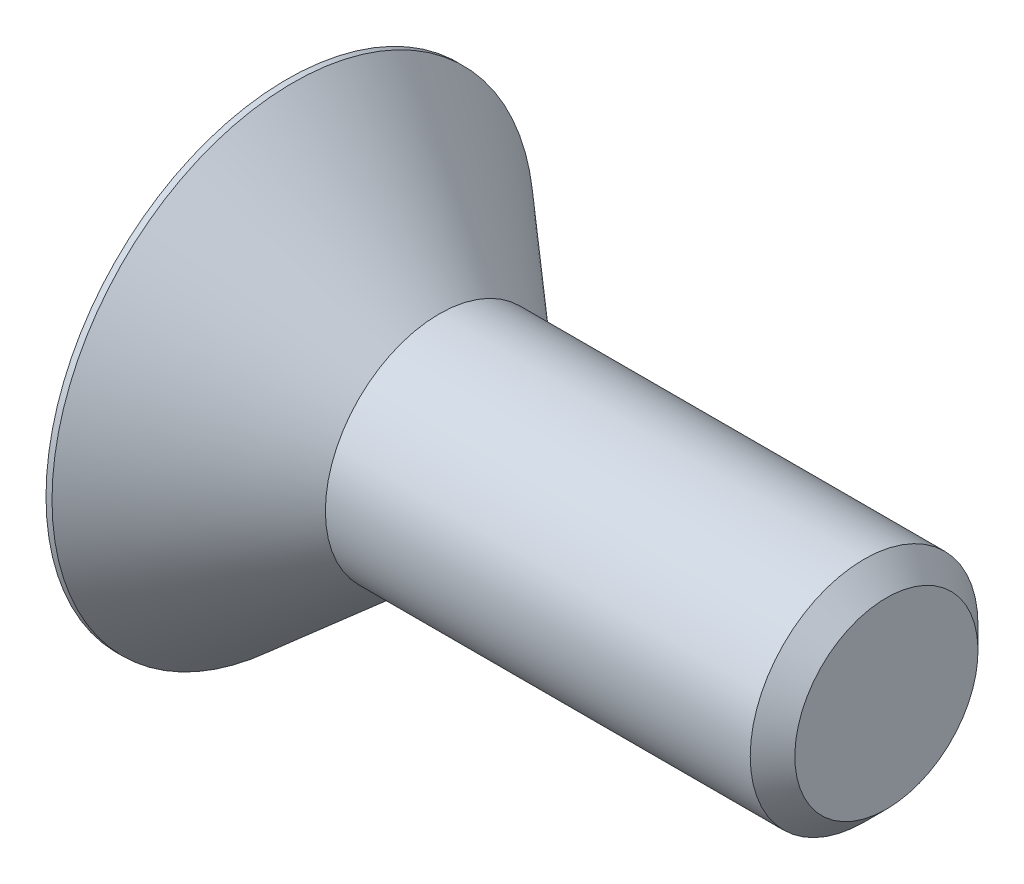
ISO-10303-21;
HEADER;
FILE_DESCRIPTION(('STEP AP214'),'2;1');
FILE_NAME('part.step','',(''),(''),'','','');
FILE_SCHEMA(('AUTOMOTIVE_DESIGN { 1 0 10303 214 1 1 1 1 }'));
ENDSEC;
DATA;
#1=APPLICATION_CONTEXT('core data for automotive mechanical design processes');
#2=APPLICATION_PROTOCOL_DEFINITION('international standard','automotive_design',2000,#1);
#3=PRODUCT_CONTEXT('',#1,'mechanical');
#4=PRODUCT('Part','Part','',(#3));
#5=PRODUCT_RELATED_PRODUCT_CATEGORY('part','',(#4));
#6=PRODUCT_DEFINITION_FORMATION('','',#4);
#7=PRODUCT_DEFINITION_CONTEXT('part definition',#1,'design');
#8=PRODUCT_DEFINITION('design','',#6,#7);
#9=PRODUCT_DEFINITION_SHAPE('','',#8);
#10=(LENGTH_UNIT() NAMED_UNIT(*) SI_UNIT(.MILLI.,.METRE.));
#11=(NAMED_UNIT(*) PLANE_ANGLE_UNIT() SI_UNIT($,.RADIAN.));
#12=(NAMED_UNIT(*) SI_UNIT($,.STERADIAN.) SOLID_ANGLE_UNIT());
#13=UNCERTAINTY_MEASURE_WITH_UNIT(LENGTH_MEASURE(1.E-05),#10,'distance_accuracy_value','');
#14=(GEOMETRIC_REPRESENTATION_CONTEXT(3) GLOBAL_UNCERTAINTY_ASSIGNED_CONTEXT((#13)) GLOBAL_UNIT_ASSIGNED_CONTEXT((#10,
#11,#12)) REPRESENTATION_CONTEXT('',''));
#15=CARTESIAN_POINT('',(0.,0.,0.));
#16=DIRECTION('',(0.,0.,1.));
#17=DIRECTION('',(1.,0.,0.));
#18=AXIS2_PLACEMENT_3D('',#15,#16,#17);
#19=CARTESIAN_POINT('',(2.20980000000282,0.,0.));
#20=DIRECTION('',(-1.,0.,0.));
#21=DIRECTION('',(0.,0.,1.));
#22=AXIS2_PLACEMENT_3D('',#19,#20,#21);
#23=CONICAL_SURFACE('',#22,1.58750000002783,1.04719755117658);
#24=CARTESIAN_POINT('',(3.12634355236696,0.,-5.6843418860808E-11));
#25=VERTEX_POINT('',#24);
#26=VERTEX_LOOP('',#25);
#27=FACE_BOUND('',#26,.T.);
#28=CARTESIAN_POINT('',(2.20980000000282,0.,0.));
#29=DIRECTION('',(-1.,0.,0.));
#30=DIRECTION('',(0.,0.,1.));
#31=AXIS2_PLACEMENT_3D('',#28,#29,#30);
#32=CIRCLE('',#31,1.58750000002783);
#33=CARTESIAN_POINT('',(2.20980000000141,1.37481532851985,-0.793750000006957));
#34=VERTEX_POINT('',#33);
#35=CARTESIAN_POINT('',(2.20980000000141,1.37481532851985,0.793750000006956));
#36=VERTEX_POINT('',#35);
#37=EDGE_CURVE('E272',#34,#36,#32,.F.);
#38=ORIENTED_EDGE('',*,*,#37,.F.);
#39=CARTESIAN_POINT('',(2.20980000000282,0.,0.));
#40=DIRECTION('',(-1.,0.,0.));
#41=DIRECTION('',(0.,0.,1.));
#42=AXIS2_PLACEMENT_3D('',#39,#40,#41);
#43=CIRCLE('',#42,1.58750000002783);
#44=CARTESIAN_POINT('',(2.20980000000141,0.,-1.58750000001392));
#45=VERTEX_POINT('',#44);
#46=EDGE_CURVE('E276',#45,#34,#43,.F.);
#47=ORIENTED_EDGE('',*,*,#46,.F.);
#48=CARTESIAN_POINT('',(2.20980000000282,0.,0.));
#49=DIRECTION('',(-1.,0.,0.));
#50=DIRECTION('',(0.,0.,1.));
#51=AXIS2_PLACEMENT_3D('',#48,#49,#50);
#52=CIRCLE('',#51,1.58750000002783);
#53=CARTESIAN_POINT('',(2.20980000000141,-1.37481532851985,-0.79375000000696));
#54=VERTEX_POINT('',#53);
#55=EDGE_CURVE('E110',#54,#45,#52,.F.);
#56=ORIENTED_EDGE('',*,*,#55,.F.);
#57=CARTESIAN_POINT('',(2.20980000000282,0.,0.));
#58=DIRECTION('',(-1.,0.,0.));
#59=DIRECTION('',(0.,0.,1.));
#60=AXIS2_PLACEMENT_3D('',#57,#58,#59);
#61=CIRCLE('',#60,1.58750000002783);
#62=CARTESIAN_POINT('',(2.20980000000141,-1.37481532851985,0.79375000000696));
#63=VERTEX_POINT('',#62);
#64=EDGE_CURVE('E20',#63,#54,#61,.F.);
#65=ORIENTED_EDGE('',*,*,#64,.F.);
#66=CARTESIAN_POINT('',(2.20980000000282,0.,0.));
#67=DIRECTION('',(-1.,0.,0.));
#68=DIRECTION('',(0.,0.,1.));
#69=AXIS2_PLACEMENT_3D('',#66,#67,#68);
#70=CIRCLE('',#69,1.58750000002783);
#71=CARTESIAN_POINT('',(2.20980000000141,0.,1.58750000001392));
#72=VERTEX_POINT('',#71);
#73=EDGE_CURVE('E107',#72,#63,#70,.F.);
#74=ORIENTED_EDGE('',*,*,#73,.F.);
#75=CARTESIAN_POINT('',(2.20980000000282,0.,0.));
#76=DIRECTION('',(-1.,0.,0.));
#77=DIRECTION('',(0.,0.,1.));
#78=AXIS2_PLACEMENT_3D('',#75,#76,#77);
#79=CIRCLE('',#78,1.58750000002783);
#80=EDGE_CURVE('E126',#36,#72,#79,.F.);
#81=ORIENTED_EDGE('',*,*,#80,.F.);
#82=EDGE_LOOP('',(#38,#47,#56,#65,#74,#81));
#83=FACE_BOUND('',#82,.T.);
#84=ADVANCED_FACE('F17',(#27,#83),#23,.F.);
#85=CARTESIAN_POINT('',(2.2098,-1.83308710467706,0.));
#86=DIRECTION('',(-1.,0.,0.));
#87=DIRECTION('',(0.,0.,1.));
#88=AXIS2_PLACEMENT_3D('',#85,#86,#87);
#89=PLANE('',#88);
#90=DIRECTION('',(0.,-0.500000000000001,0.866025403784438));
#91=VECTOR('',#90,1.);
#92=CARTESIAN_POINT('',(2.2098,-1.83308710467706,0.));
#93=LINE('',#92,#91);
#94=CARTESIAN_POINT('',(2.2098,-1.83308710467706,0.));
#95=VERTEX_POINT('',#94);
#96=EDGE_CURVE('E131',#95,#54,#93,.F.);
#97=ORIENTED_EDGE('',*,*,#96,.F.);
#98=DIRECTION('',(0.,0.500000000000002,0.866025403784438));
#99=VECTOR('',#98,1.);
#100=CARTESIAN_POINT('',(2.2098,-0.916543552338528,1.5875));
#101=LINE('',#100,#99);
#102=EDGE_CURVE('E128',#63,#95,#101,.F.);
#103=ORIENTED_EDGE('',*,*,#102,.F.);
#104=ORIENTED_EDGE('',*,*,#64,.T.);
#105=EDGE_LOOP('',(#97,#103,#104));
#106=FACE_BOUND('',#105,.T.);
#107=ADVANCED_FACE('F129',(#106),#89,.T.);
#108=CARTESIAN_POINT('',(2.2098,-1.83308710467706,0.));
#109=DIRECTION('',(-1.,0.,0.));
#110=DIRECTION('',(0.,0.,1.));
#111=AXIS2_PLACEMENT_3D('',#108,#109,#110);
#112=PLANE('',#111);
#113=DIRECTION('',(0.,1.,0.));
#114=VECTOR('',#113,1.);
#115=CARTESIAN_POINT('',(2.2098,-0.91654355233853,-1.5875));
#116=LINE('',#115,#114);
#117=CARTESIAN_POINT('',(2.2098,-0.91654355233853,-1.5875));
#118=VERTEX_POINT('',#117);
#119=EDGE_CURVE('E213',#118,#45,#116,.T.);
#120=ORIENTED_EDGE('',*,*,#119,.F.);
#121=DIRECTION('',(0.,-0.500000000000001,0.866025403784438));
#122=VECTOR('',#121,1.);
#123=CARTESIAN_POINT('',(2.2098,-1.83308710467706,0.));
#124=LINE('',#123,#122);
#125=EDGE_CURVE('E231',#54,#118,#124,.F.);
#126=ORIENTED_EDGE('',*,*,#125,.F.);
#127=ORIENTED_EDGE('',*,*,#55,.T.);
#128=EDGE_LOOP('',(#120,#126,#127));
#129=FACE_BOUND('',#128,.T.);
#130=ADVANCED_FACE('F283',(#129),#112,.T.);
#131=CARTESIAN_POINT('',(2.2098,-1.83308710467706,0.));
#132=DIRECTION('',(-1.,0.,0.));
#133=DIRECTION('',(0.,0.,1.));
#134=AXIS2_PLACEMENT_3D('',#131,#132,#133);
#135=PLANE('',#134);
#136=DIRECTION('',(0.,-0.5,-0.866025403784439));
#137=VECTOR('',#136,1.);
#138=CARTESIAN_POINT('',(2.2098,0.91654355233853,-1.5875));
#139=LINE('',#138,#137);
#140=CARTESIAN_POINT('',(2.2098,0.91654355233853,-1.5875));
#141=VERTEX_POINT('',#140);
#142=EDGE_CURVE('E190',#141,#34,#139,.F.);
#143=ORIENTED_EDGE('',*,*,#142,.F.);
#144=DIRECTION('',(0.,1.,0.));
#145=VECTOR('',#144,1.);
#146=CARTESIAN_POINT('',(2.2098,-0.91654355233853,-1.5875));
#147=LINE('',#146,#145);
#148=EDGE_CURVE('E208',#45,#141,#147,.T.);
#149=ORIENTED_EDGE('',*,*,#148,.F.);
#150=ORIENTED_EDGE('',*,*,#46,.T.);
#151=EDGE_LOOP('',(#143,#149,#150));
#152=FACE_BOUND('',#151,.T.);
#153=ADVANCED_FACE('F286',(#152),#135,.T.);
#154=CARTESIAN_POINT('',(2.2098,-1.83308710467706,0.));
#155=DIRECTION('',(-1.,0.,0.));
#156=DIRECTION('',(0.,0.,1.));
#157=AXIS2_PLACEMENT_3D('',#154,#155,#156);
#158=PLANE('',#157);
#159=DIRECTION('',(0.,0.499999999999999,-0.866025403784439));
#160=VECTOR('',#159,1.);
#161=CARTESIAN_POINT('',(2.2098,1.83308710467706,0.));
#162=LINE('',#161,#160);
#163=CARTESIAN_POINT('',(2.2098,1.83308710467706,0.));
#164=VERTEX_POINT('',#163);
#165=EDGE_CURVE('E159',#164,#36,#162,.F.);
#166=ORIENTED_EDGE('',*,*,#165,.F.);
#167=DIRECTION('',(0.,-0.5,-0.866025403784439));
#168=VECTOR('',#167,1.);
#169=CARTESIAN_POINT('',(2.2098,0.91654355233853,-1.5875));
#170=LINE('',#169,#168);
#171=EDGE_CURVE('E185',#34,#164,#170,.F.);
#172=ORIENTED_EDGE('',*,*,#171,.F.);
#173=ORIENTED_EDGE('',*,*,#37,.T.);
#174=EDGE_LOOP('',(#166,#172,#173));
#175=FACE_BOUND('',#174,.T.);
#176=ADVANCED_FACE('F310',(#175),#158,.T.);
#177=CARTESIAN_POINT('',(2.2098,-1.83308710467706,0.));
#178=DIRECTION('',(-1.,0.,0.));
#179=DIRECTION('',(0.,0.,1.));
#180=AXIS2_PLACEMENT_3D('',#177,#178,#179);
#181=PLANE('',#180);
#182=DIRECTION('',(0.,1.,0.));
#183=VECTOR('',#182,1.);
#184=CARTESIAN_POINT('',(2.2098,0.91654355233853,1.5875));
#185=LINE('',#184,#183);
#186=CARTESIAN_POINT('',(2.2098,0.91654355233853,1.5875));
#187=VERTEX_POINT('',#186);
#188=EDGE_CURVE('E153',#187,#72,#185,.F.);
#189=ORIENTED_EDGE('',*,*,#188,.F.);
#190=DIRECTION('',(0.,0.499999999999999,-0.866025403784439));
#191=VECTOR('',#190,1.);
#192=CARTESIAN_POINT('',(2.2098,1.83308710467706,0.));
#193=LINE('',#192,#191);
#194=EDGE_CURVE('E154',#36,#187,#193,.F.);
#195=ORIENTED_EDGE('',*,*,#194,.F.);
#196=ORIENTED_EDGE('',*,*,#80,.T.);
#197=EDGE_LOOP('',(#189,#195,#196));
#198=FACE_BOUND('',#197,.T.);
#199=ADVANCED_FACE('F314',(#198),#181,.T.);
#200=CARTESIAN_POINT('',(2.2098,-1.83308710467706,0.));
#201=DIRECTION('',(-1.,0.,0.));
#202=DIRECTION('',(0.,0.,1.));
#203=AXIS2_PLACEMENT_3D('',#200,#201,#202);
#204=PLANE('',#203);
#205=DIRECTION('',(0.,0.500000000000002,0.866025403784438));
#206=VECTOR('',#205,1.);
#207=CARTESIAN_POINT('',(2.2098,-0.916543552338528,1.5875));
#208=LINE('',#207,#206);
#209=CARTESIAN_POINT('',(2.2098,-0.916543552338528,1.5875));
#210=VERTEX_POINT('',#209);
#211=EDGE_CURVE('E120',#210,#63,#208,.F.);
#212=ORIENTED_EDGE('',*,*,#211,.F.);
#213=DIRECTION('',(0.,1.,0.));
#214=VECTOR('',#213,1.);
#215=CARTESIAN_POINT('',(2.2098,0.91654355233853,1.5875));
#216=LINE('',#215,#214);
#217=EDGE_CURVE('E123',#72,#210,#216,.F.);
#218=ORIENTED_EDGE('',*,*,#217,.F.);
#219=ORIENTED_EDGE('',*,*,#73,.T.);
#220=EDGE_LOOP('',(#212,#218,#219));
#221=FACE_BOUND('',#220,.T.);
#222=ADVANCED_FACE('F118',(#221),#204,.T.);
#223=CARTESIAN_POINT('',(2.2098,-0.916543552338528,1.5875));
#224=DIRECTION('',(0.,0.866025403784438,-0.500000000000002));
#225=DIRECTION('',(0.,0.500000000000002,0.866025403784438));
#226=AXIS2_PLACEMENT_3D('',#223,#224,#225);
#227=PLANE('',#226);
#228=ORIENTED_EDGE('',*,*,#102,.T.);
#229=DIRECTION('',(1.,0.,0.));
#230=VECTOR('',#229,1.);
#231=CARTESIAN_POINT('',(2.2098,-1.83308710467706,0.));
#232=LINE('',#231,#230);
#233=CARTESIAN_POINT('',(0.,-1.83308710467706,0.));
#234=VERTEX_POINT('',#233);
#235=EDGE_CURVE('E135',#234,#95,#232,.T.);
#236=ORIENTED_EDGE('',*,*,#235,.F.);
#237=DIRECTION('',(0.,-0.500000000000002,-0.866025403784438));
#238=VECTOR('',#237,1.);
#239=CARTESIAN_POINT('',(0.,-0.916543552338528,1.5875));
#240=LINE('',#239,#238);
#241=CARTESIAN_POINT('',(0.,-0.916543552338528,1.5875));
#242=VERTEX_POINT('',#241);
#243=EDGE_CURVE('E241',#242,#234,#240,.T.);
#244=ORIENTED_EDGE('',*,*,#243,.F.);
#245=DIRECTION('',(1.,0.,0.));
#246=VECTOR('',#245,1.);
#247=CARTESIAN_POINT('',(2.2098,-0.916543552338528,1.5875));
#248=LINE('',#247,#246);
#249=EDGE_CURVE('E140',#210,#242,#248,.F.);
#250=ORIENTED_EDGE('',*,*,#249,.F.);
#251=ORIENTED_EDGE('',*,*,#211,.T.);
#252=EDGE_LOOP('',(#228,#236,#244,#250,#251));
#253=FACE_BOUND('',#252,.T.);
#254=ADVANCED_FACE('F137',(#253),#227,.T.);
#255=CARTESIAN_POINT('',(2.2098,-1.83308710467706,0.));
#256=DIRECTION('',(0.,0.866025403784438,0.500000000000001));
#257=DIRECTION('',(0.,-0.500000000000001,0.866025403784438));
#258=AXIS2_PLACEMENT_3D('',#255,#256,#257);
#259=PLANE('',#258);
#260=ORIENTED_EDGE('',*,*,#125,.T.);
#261=DIRECTION('',(1.,0.,0.));
#262=VECTOR('',#261,1.);
#263=CARTESIAN_POINT('',(2.2098,-0.91654355233853,-1.5875));
#264=LINE('',#263,#262);
#265=CARTESIAN_POINT('',(0.,-0.91654355233853,-1.5875));
#266=VERTEX_POINT('',#265);
#267=EDGE_CURVE('E225',#266,#118,#264,.T.);
#268=ORIENTED_EDGE('',*,*,#267,.F.);
#269=DIRECTION('',(0.,0.500000000000001,-0.866025403784438));
#270=VECTOR('',#269,1.);
#271=CARTESIAN_POINT('',(0.,-1.83308710467706,0.));
#272=LINE('',#271,#270);
#273=EDGE_CURVE('E219',#234,#266,#272,.T.);
#274=ORIENTED_EDGE('',*,*,#273,.F.);
#275=ORIENTED_EDGE('',*,*,#235,.T.);
#276=ORIENTED_EDGE('',*,*,#96,.T.);
#277=EDGE_LOOP('',(#260,#268,#274,#275,#276));
#278=FACE_BOUND('',#277,.T.);
#279=ADVANCED_FACE('F293',(#278),#259,.T.);
#280=CARTESIAN_POINT('',(2.2098,-0.91654355233853,-1.5875));
#281=DIRECTION('',(0.,0.,1.));
#282=DIRECTION('',(1.,0.,0.));
#283=AXIS2_PLACEMENT_3D('',#280,#281,#282);
#284=PLANE('',#283);
#285=ORIENTED_EDGE('',*,*,#148,.T.);
#286=DIRECTION('',(1.,0.,0.));
#287=VECTOR('',#286,1.);
#288=CARTESIAN_POINT('',(2.2098,0.91654355233853,-1.5875));
#289=LINE('',#288,#287);
#290=CARTESIAN_POINT('',(0.,0.91654355233853,-1.5875));
#291=VERTEX_POINT('',#290);
#292=EDGE_CURVE('E202',#291,#141,#289,.T.);
#293=ORIENTED_EDGE('',*,*,#292,.F.);
#294=DIRECTION('',(0.,1.,0.));
#295=VECTOR('',#294,1.);
#296=CARTESIAN_POINT('',(0.,0.,-1.5875));
#297=LINE('',#296,#295);
#298=EDGE_CURVE('E196',#266,#291,#297,.T.);
#299=ORIENTED_EDGE('',*,*,#298,.F.);
#300=ORIENTED_EDGE('',*,*,#267,.T.);
#301=ORIENTED_EDGE('',*,*,#119,.T.);
#302=EDGE_LOOP('',(#285,#293,#299,#300,#301));
#303=FACE_BOUND('',#302,.T.);
#304=ADVANCED_FACE('F289',(#303),#284,.T.);
#305=CARTESIAN_POINT('',(2.2098,0.91654355233853,-1.5875));
#306=DIRECTION('',(0.,-0.866025403784439,0.5));
#307=DIRECTION('',(0.,-0.5,-0.866025403784439));
#308=AXIS2_PLACEMENT_3D('',#305,#306,#307);
#309=PLANE('',#308);
#310=ORIENTED_EDGE('',*,*,#171,.T.);
#311=DIRECTION('',(1.,0.,0.));
#312=VECTOR('',#311,1.);
#313=CARTESIAN_POINT('',(2.2098,1.83308710467706,0.));
#314=LINE('',#313,#312);
#315=CARTESIAN_POINT('',(0.,1.83308710467706,0.));
#316=VERTEX_POINT('',#315);
#317=EDGE_CURVE('E179',#316,#164,#314,.T.);
#318=ORIENTED_EDGE('',*,*,#317,.F.);
#319=DIRECTION('',(0.,0.5,0.866025403784439));
#320=VECTOR('',#319,1.);
#321=CARTESIAN_POINT('',(0.,0.91654355233853,-1.5875));
#322=LINE('',#321,#320);
#323=EDGE_CURVE('E173',#291,#316,#322,.T.);
#324=ORIENTED_EDGE('',*,*,#323,.F.);
#325=ORIENTED_EDGE('',*,*,#292,.T.);
#326=ORIENTED_EDGE('',*,*,#142,.T.);
#327=EDGE_LOOP('',(#310,#318,#324,#325,#326));
#328=FACE_BOUND('',#327,.T.);
#329=ADVANCED_FACE('F308',(#328),#309,.T.);
#330=CARTESIAN_POINT('',(2.2098,1.83308710467706,0.));
#331=DIRECTION('',(0.,-0.866025403784439,-0.499999999999999));
#332=DIRECTION('',(0.,0.499999999999999,-0.866025403784439));
#333=AXIS2_PLACEMENT_3D('',#330,#331,#332);
#334=PLANE('',#333);
#335=ORIENTED_EDGE('',*,*,#194,.T.);
#336=DIRECTION('',(1.,0.,0.));
#337=VECTOR('',#336,1.);
#338=CARTESIAN_POINT('',(2.2098,0.91654355233853,1.5875));
#339=LINE('',#338,#337);
#340=CARTESIAN_POINT('',(0.,0.91654355233853,1.5875));
#341=VERTEX_POINT('',#340);
#342=EDGE_CURVE('E40',#341,#187,#339,.T.);
#343=ORIENTED_EDGE('',*,*,#342,.F.);
#344=DIRECTION('',(0.,-0.499999999999999,0.866025403784439));
#345=VECTOR('',#344,1.);
#346=CARTESIAN_POINT('',(0.,1.83308710467706,0.));
#347=LINE('',#346,#345);
#348=EDGE_CURVE('E167',#316,#341,#347,.T.);
#349=ORIENTED_EDGE('',*,*,#348,.F.);
#350=ORIENTED_EDGE('',*,*,#317,.T.);
#351=ORIENTED_EDGE('',*,*,#165,.T.);
#352=EDGE_LOOP('',(#335,#343,#349,#350,#351));
#353=FACE_BOUND('',#352,.T.);
#354=ADVANCED_FACE('F305',(#353),#334,.T.);
#355=CARTESIAN_POINT('',(2.2098,0.91654355233853,1.5875));
#356=DIRECTION('',(0.,0.,-1.));
#357=DIRECTION('',(0.,1.,0.));
#358=AXIS2_PLACEMENT_3D('',#355,#356,#357);
#359=PLANE('',#358);
#360=ORIENTED_EDGE('',*,*,#217,.T.);
#361=ORIENTED_EDGE('',*,*,#249,.T.);
#362=DIRECTION('',(0.,1.,0.));
#363=VECTOR('',#362,1.);
#364=CARTESIAN_POINT('',(0.,0.,1.5875));
#365=LINE('',#364,#363);
#366=EDGE_CURVE('E162',#341,#242,#365,.F.);
#367=ORIENTED_EDGE('',*,*,#366,.F.);
#368=ORIENTED_EDGE('',*,*,#342,.T.);
#369=ORIENTED_EDGE('',*,*,#188,.T.);
#370=EDGE_LOOP('',(#360,#361,#367,#368,#369));
#371=FACE_BOUND('',#370,.T.);
#372=ADVANCED_FACE('F300',(#371),#359,.T.);
#373=CARTESIAN_POINT('',(0.,0.,0.));
#374=DIRECTION('',(-1.,0.,0.));
#375=DIRECTION('',(0.,0.,1.));
#376=AXIS2_PLACEMENT_3D('',#373,#374,#375);
#377=PLANE('',#376);
#378=ORIENTED_EDGE('',*,*,#348,.T.);
#379=ORIENTED_EDGE('',*,*,#366,.T.);
#380=ORIENTED_EDGE('',*,*,#243,.T.);
#381=ORIENTED_EDGE('',*,*,#273,.T.);
#382=ORIENTED_EDGE('',*,*,#298,.T.);
#383=ORIENTED_EDGE('',*,*,#323,.T.);
#384=EDGE_LOOP('',(#378,#379,#380,#381,#382,#383));
#385=FACE_BOUND('',#384,.T.);
#386=CARTESIAN_POINT('',(0.,0.,0.));
#387=DIRECTION('',(-1.,0.,0.));
#388=DIRECTION('',(0.,0.,1.));
#389=AXIS2_PLACEMENT_3D('',#386,#387,#388);
#390=CIRCLE('',#389,5.10667);
#391=CARTESIAN_POINT('',(0.,0.,5.10667));
#392=VERTEX_POINT('',#391);
#393=EDGE_CURVE('E166',#392,#392,#390,.F.);
#394=ORIENTED_EDGE('',*,*,#393,.F.);
#395=EDGE_LOOP('',(#394));
#396=FACE_BOUND('',#395,.T.);
#397=ADVANCED_FACE('F302',(#385,#396),#377,.T.);
#398=CARTESIAN_POINT('',(12.7,1.94056,0.));
#399=DIRECTION('',(1.,0.,0.));
#400=DIRECTION('',(0.,0.,-1.));
#401=AXIS2_PLACEMENT_3D('',#398,#399,#400);
#402=PLANE('',#401);
#403=CARTESIAN_POINT('',(12.6999999999384,0.,0.));
#404=DIRECTION('',(-1.,0.,0.));
#405=DIRECTION('',(0.,-1.,0.));
#406=AXIS2_PLACEMENT_3D('',#403,#404,#405);
#407=CIRCLE('',#406,1.94056000003684);
#408=CARTESIAN_POINT('',(12.6999999999384,-1.94056000003684,0.));
#409=VERTEX_POINT('',#408);
#410=EDGE_CURVE('E259',#409,#409,#407,.T.);
#411=ORIENTED_EDGE('',*,*,#410,.F.);
#412=EDGE_LOOP('',(#411));
#413=FACE_BOUND('',#412,.T.);
#414=ADVANCED_FACE('F352',(#413),#402,.T.);
#415=CARTESIAN_POINT('',(0.,0.,0.));
#416=DIRECTION('',(-1.,0.,0.));
#417=DIRECTION('',(0.,0.,1.));
#418=AXIS2_PLACEMENT_3D('',#415,#416,#417);
#419=CYLINDRICAL_SURFACE('',#418,5.10667);
#420=ORIENTED_EDGE('',*,*,#393,.T.);
#421=EDGE_LOOP('',(#420));
#422=FACE_BOUND('',#421,.T.);
#423=CARTESIAN_POINT('',(0.12700000007726,0.,0.));
#424=DIRECTION('',(-1.,0.,0.));
#425=DIRECTION('',(0.,0.,1.));
#426=AXIS2_PLACEMENT_3D('',#423,#424,#425);
#427=CIRCLE('',#426,5.10666999997511);
#428=CARTESIAN_POINT('',(0.12700000007726,0.,5.10666999997511));
#429=VERTEX_POINT('',#428);
#430=EDGE_CURVE('E262',#429,#429,#427,.F.);
#431=ORIENTED_EDGE('',*,*,#430,.F.);
#432=EDGE_LOOP('',(#431));
#433=FACE_BOUND('',#432,.T.);
#434=ADVANCED_FACE('F342',(#422,#433),#419,.T.);
#435=CARTESIAN_POINT('',(12.2275599999853,0.,0.));
#436=DIRECTION('',(-1.,0.,0.));
#437=DIRECTION('',(0.,-1.,0.));
#438=AXIS2_PLACEMENT_3D('',#435,#436,#437);
#439=CONICAL_SURFACE('',#438,2.41299999999001,0.785398163397448);
#440=ORIENTED_EDGE('',*,*,#410,.T.);
#441=EDGE_LOOP('',(#440));
#442=FACE_BOUND('',#441,.T.);
#443=CARTESIAN_POINT('',(12.22756,0.,0.));
#444=DIRECTION('',(-1.,0.,0.));
#445=DIRECTION('',(0.,0.,1.));
#446=AXIS2_PLACEMENT_3D('',#443,#444,#445);
#447=CIRCLE('',#446,2.41299999999999);
#448=CARTESIAN_POINT('',(12.22756,0.,2.41299999999999));
#449=VERTEX_POINT('',#448);
#450=EDGE_CURVE('E27',#449,#449,#447,.T.);
#451=ORIENTED_EDGE('',*,*,#450,.F.);
#452=EDGE_LOOP('',(#451));
#453=FACE_BOUND('',#452,.T.);
#454=ADVANCED_FACE('F339',(#442,#453),#439,.T.);
#455=CARTESIAN_POINT('',(0.12700000024779,0.,0.));
#456=DIRECTION('',(-1.,0.,0.));
#457=DIRECTION('',(0.,0.,1.));
#458=AXIS2_PLACEMENT_3D('',#455,#456,#457);
#459=CONICAL_SURFACE('',#458,5.10666999986142,0.715584993323263);
#460=ORIENTED_EDGE('',*,*,#430,.T.);
#461=EDGE_LOOP('',(#460));
#462=FACE_BOUND('',#461,.T.);
#463=CARTESIAN_POINT('',(3.225712867479,0.,0.));
#464=DIRECTION('',(-1.,0.,0.));
#465=DIRECTION('',(0.,0.,1.));
#466=AXIS2_PLACEMENT_3D('',#463,#464,#465);
#467=CIRCLE('',#466,2.41299999999999);
#468=CARTESIAN_POINT('',(3.225712867479,0.,2.41299999999999));
#469=VERTEX_POINT('',#468);
#470=EDGE_CURVE('E11',#469,#469,#467,.F.);
#471=ORIENTED_EDGE('',*,*,#470,.F.);
#472=EDGE_LOOP('',(#471));
#473=FACE_BOUND('',#472,.T.);
#474=ADVANCED_FACE('F341',(#462,#473),#459,.T.);
#475=CARTESIAN_POINT('',(0.,0.,0.));
#476=DIRECTION('',(-1.,0.,0.));
#477=DIRECTION('',(0.,0.,1.));
#478=AXIS2_PLACEMENT_3D('',#475,#476,#477);
#479=CYLINDRICAL_SURFACE('',#478,2.41299999999999);
#480=ORIENTED_EDGE('',*,*,#470,.T.);
#481=EDGE_LOOP('',(#480));
#482=FACE_BOUND('',#481,.T.);
#483=ORIENTED_EDGE('',*,*,#450,.T.);
#484=EDGE_LOOP('',(#483));
#485=FACE_BOUND('',#484,.T.);
#486=ADVANCED_FACE('F337',(#482,#485),#479,.T.);
#487=CLOSED_SHELL('',(#84,#107,#130,#153,#176,#199,#222,#254,#279,#304,#329,#354,#372,#397,#414,
#434,#454,#474,#486));
#488=MANIFOLD_SOLID_BREP('B1',#487);
#489=ADVANCED_BREP_SHAPE_REPRESENTATION('',(#18,#488),#14);
#490=SHAPE_DEFINITION_REPRESENTATION(#9,#489);
ENDSEC;
END-ISO-10303-21;
